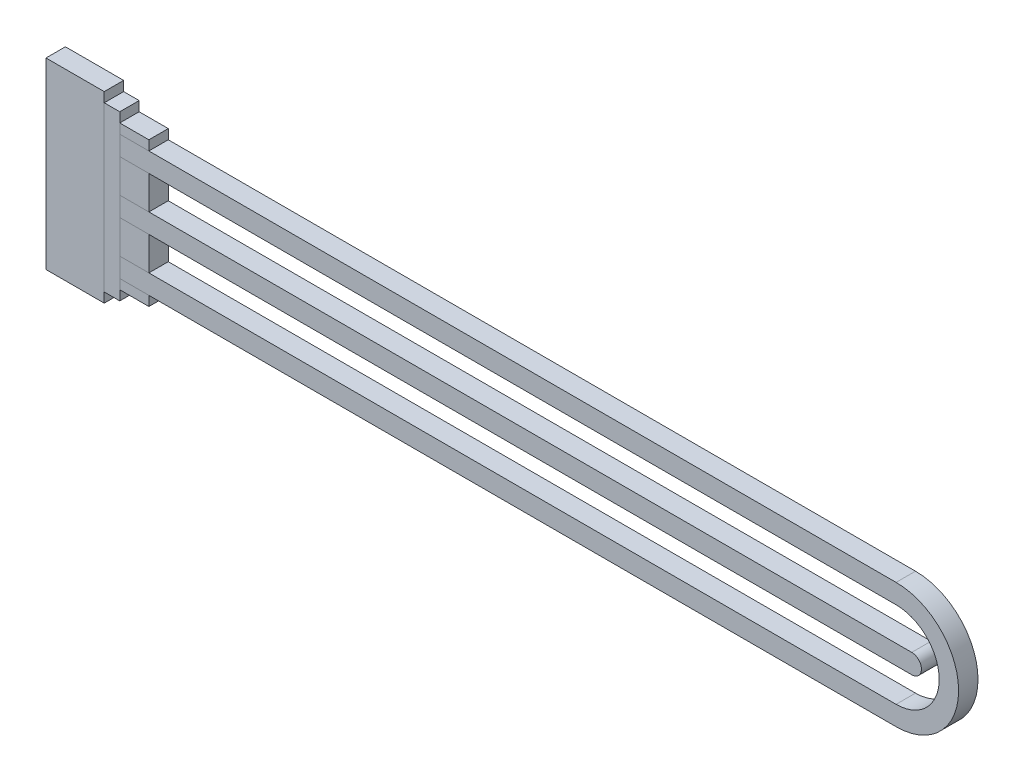
ISO-10303-21;
HEADER;
FILE_DESCRIPTION(('STEP AP214'),'2;1');
FILE_NAME('part.step','',(''),(''),'','','');
FILE_SCHEMA(('AUTOMOTIVE_DESIGN { 1 0 10303 214 1 1 1 1 }'));
ENDSEC;
DATA;
#1=APPLICATION_CONTEXT('core data for automotive mechanical design processes');
#2=APPLICATION_PROTOCOL_DEFINITION('international standard','automotive_design',2000,#1);
#3=PRODUCT_CONTEXT('',#1,'mechanical');
#4=PRODUCT('Part','Part','',(#3));
#5=PRODUCT_RELATED_PRODUCT_CATEGORY('part','',(#4));
#6=PRODUCT_DEFINITION_FORMATION('','',#4);
#7=PRODUCT_DEFINITION_CONTEXT('part definition',#1,'design');
#8=PRODUCT_DEFINITION('design','',#6,#7);
#9=PRODUCT_DEFINITION_SHAPE('','',#8);
#10=(LENGTH_UNIT() NAMED_UNIT(*) SI_UNIT(.MILLI.,.METRE.));
#11=(NAMED_UNIT(*) PLANE_ANGLE_UNIT() SI_UNIT($,.RADIAN.));
#12=(NAMED_UNIT(*) SI_UNIT($,.STERADIAN.) SOLID_ANGLE_UNIT());
#13=UNCERTAINTY_MEASURE_WITH_UNIT(LENGTH_MEASURE(1.E-05),#10,'distance_accuracy_value','');
#14=(GEOMETRIC_REPRESENTATION_CONTEXT(3) GLOBAL_UNCERTAINTY_ASSIGNED_CONTEXT((#13)) GLOBAL_UNIT_ASSIGNED_CONTEXT((#10,
#11,#12)) REPRESENTATION_CONTEXT('',''));
#15=CARTESIAN_POINT('',(0.,0.,0.));
#16=DIRECTION('',(0.,0.,1.));
#17=DIRECTION('',(1.,0.,0.));
#18=AXIS2_PLACEMENT_3D('',#15,#16,#17);
#19=CARTESIAN_POINT('',(-38.,15.,9.99999999999998));
#20=DIRECTION('',(0.,0.,-1.));
#21=DIRECTION('',(-1.,0.,0.));
#22=AXIS2_PLACEMENT_3D('',#19,#20,#21);
#23=PLANE('',#22);
#24=DIRECTION('',(0.,1.,0.));
#25=VECTOR('',#24,1.);
#26=CARTESIAN_POINT('',(-7.99999999999999,15.,9.99999999999998));
#27=LINE('',#26,#25);
#28=CARTESIAN_POINT('',(-7.99999999999999,-79.4096844460773,9.99999999999998));
#29=VERTEX_POINT('',#28);
#30=CARTESIAN_POINT('',(-7.99999999999999,15.,9.99999999999998));
#31=VERTEX_POINT('',#30);
#32=EDGE_CURVE('E112',#29,#31,#27,.T.);
#33=ORIENTED_EDGE('',*,*,#32,.T.);
#34=DIRECTION('',(1.,0.,0.));
#35=VECTOR('',#34,1.);
#36=CARTESIAN_POINT('',(-38.,15.,9.99999999999998));
#37=LINE('',#36,#35);
#38=CARTESIAN_POINT('',(-38.,15.,9.99999999999998));
#39=VERTEX_POINT('',#38);
#40=EDGE_CURVE('E12',#39,#31,#37,.T.);
#41=ORIENTED_EDGE('',*,*,#40,.F.);
#42=DIRECTION('',(0.,1.,0.));
#43=VECTOR('',#42,1.);
#44=CARTESIAN_POINT('',(-38.,15.,9.99999999999998));
#45=LINE('',#44,#43);
#46=CARTESIAN_POINT('',(-38.,-79.4096844460773,9.99999999999998));
#47=VERTEX_POINT('',#46);
#48=EDGE_CURVE('E100',#47,#39,#45,.T.);
#49=ORIENTED_EDGE('',*,*,#48,.F.);
#50=DIRECTION('',(1.,0.,0.));
#51=VECTOR('',#50,1.);
#52=CARTESIAN_POINT('',(-38.,-79.4096844460773,9.99999999999998));
#53=LINE('',#52,#51);
#54=EDGE_CURVE('E108',#47,#29,#53,.T.);
#55=ORIENTED_EDGE('',*,*,#54,.T.);
#56=EDGE_LOOP('',(#33,#41,#49,#55));
#57=FACE_BOUND('',#56,.T.);
#58=ADVANCED_FACE('F49',(#57),#23,.F.);
#59=CARTESIAN_POINT('',(-38.,15.,0.));
#60=DIRECTION('',(0.,-1.,0.));
#61=DIRECTION('',(0.,0.,-1.));
#62=AXIS2_PLACEMENT_3D('',#59,#60,#61);
#63=PLANE('',#62);
#64=DIRECTION('',(0.,0.,-1.));
#65=VECTOR('',#64,1.);
#66=CARTESIAN_POINT('',(-7.99999999999999,15.,0.));
#67=LINE('',#66,#65);
#68=CARTESIAN_POINT('',(-7.99999999999999,15.,0.));
#69=VERTEX_POINT('',#68);
#70=EDGE_CURVE('E104',#31,#69,#67,.T.);
#71=ORIENTED_EDGE('',*,*,#70,.T.);
#72=DIRECTION('',(1.,0.,0.));
#73=VECTOR('',#72,1.);
#74=CARTESIAN_POINT('',(-38.,15.,0.));
#75=LINE('',#74,#73);
#76=CARTESIAN_POINT('',(-38.,15.,0.));
#77=VERTEX_POINT('',#76);
#78=EDGE_CURVE('E57',#77,#69,#75,.T.);
#79=ORIENTED_EDGE('',*,*,#78,.F.);
#80=DIRECTION('',(0.,0.,-1.));
#81=VECTOR('',#80,1.);
#82=CARTESIAN_POINT('',(-38.,15.,0.));
#83=LINE('',#82,#81);
#84=EDGE_CURVE('E95',#39,#77,#83,.T.);
#85=ORIENTED_EDGE('',*,*,#84,.F.);
#86=ORIENTED_EDGE('',*,*,#40,.T.);
#87=EDGE_LOOP('',(#71,#79,#85,#86));
#88=FACE_BOUND('',#87,.T.);
#89=ADVANCED_FACE('F103',(#88),#63,.F.);
#90=CARTESIAN_POINT('',(-38.,15.,0.));
#91=DIRECTION('',(0.,0.,1.));
#92=DIRECTION('',(0.,-1.,0.));
#93=AXIS2_PLACEMENT_3D('',#90,#91,#92);
#94=PLANE('',#93);
#95=DIRECTION('',(0.,-1.,0.));
#96=VECTOR('',#95,1.);
#97=CARTESIAN_POINT('',(-7.99999999999999,15.,0.));
#98=LINE('',#97,#96);
#99=CARTESIAN_POINT('',(-7.99999999999999,-79.4096844460773,0.));
#100=VERTEX_POINT('',#99);
#101=EDGE_CURVE('E82',#69,#100,#98,.T.);
#102=ORIENTED_EDGE('',*,*,#101,.T.);
#103=DIRECTION('',(1.,0.,0.));
#104=VECTOR('',#103,1.);
#105=CARTESIAN_POINT('',(-38.,-79.4096844460773,0.));
#106=LINE('',#105,#104);
#107=CARTESIAN_POINT('',(-38.,-79.4096844460773,0.));
#108=VERTEX_POINT('',#107);
#109=EDGE_CURVE('E105',#108,#100,#106,.T.);
#110=ORIENTED_EDGE('',*,*,#109,.F.);
#111=DIRECTION('',(0.,-1.,0.));
#112=VECTOR('',#111,1.);
#113=CARTESIAN_POINT('',(-38.,15.,0.));
#114=LINE('',#113,#112);
#115=EDGE_CURVE('E98',#77,#108,#114,.T.);
#116=ORIENTED_EDGE('',*,*,#115,.F.);
#117=ORIENTED_EDGE('',*,*,#78,.T.);
#118=EDGE_LOOP('',(#102,#110,#116,#117));
#119=FACE_BOUND('',#118,.T.);
#120=ADVANCED_FACE('F106',(#119),#94,.F.);
#121=CARTESIAN_POINT('',(-38.,-79.4096844460773,0.));
#122=DIRECTION('',(0.,1.,0.));
#123=DIRECTION('',(0.,0.,1.));
#124=AXIS2_PLACEMENT_3D('',#121,#122,#123);
#125=PLANE('',#124);
#126=DIRECTION('',(0.,0.,1.));
#127=VECTOR('',#126,1.);
#128=CARTESIAN_POINT('',(-7.99999999999999,-79.4096844460773,0.));
#129=LINE('',#128,#127);
#130=EDGE_CURVE('E88',#100,#29,#129,.T.);
#131=ORIENTED_EDGE('',*,*,#130,.T.);
#132=ORIENTED_EDGE('',*,*,#54,.F.);
#133=DIRECTION('',(0.,0.,1.));
#134=VECTOR('',#133,1.);
#135=CARTESIAN_POINT('',(-38.,-79.4096844460773,0.));
#136=LINE('',#135,#134);
#137=EDGE_CURVE('E65',#108,#47,#136,.T.);
#138=ORIENTED_EDGE('',*,*,#137,.F.);
#139=ORIENTED_EDGE('',*,*,#109,.T.);
#140=EDGE_LOOP('',(#131,#132,#138,#139));
#141=FACE_BOUND('',#140,.T.);
#142=ADVANCED_FACE('F119',(#141),#125,.F.);
#143=CARTESIAN_POINT('',(-38.,0.,0.));
#144=DIRECTION('',(-1.,0.,0.));
#145=DIRECTION('',(0.,0.,1.));
#146=AXIS2_PLACEMENT_3D('',#143,#144,#145);
#147=PLANE('',#146);
#148=ORIENTED_EDGE('',*,*,#48,.T.);
#149=ORIENTED_EDGE('',*,*,#84,.T.);
#150=ORIENTED_EDGE('',*,*,#115,.T.);
#151=ORIENTED_EDGE('',*,*,#137,.T.);
#152=EDGE_LOOP('',(#148,#149,#150,#151));
#153=FACE_BOUND('',#152,.T.);
#154=ADVANCED_FACE('F96',(#153),#147,.T.);
#155=CARTESIAN_POINT('',(-7.99999999999999,0.,0.));
#156=DIRECTION('',(-1.,0.,0.));
#157=DIRECTION('',(0.,0.,1.));
#158=AXIS2_PLACEMENT_3D('',#155,#156,#157);
#159=PLANE('',#158);
#160=ORIENTED_EDGE('',*,*,#32,.F.);
#161=ORIENTED_EDGE('',*,*,#130,.F.);
#162=ORIENTED_EDGE('',*,*,#101,.F.);
#163=ORIENTED_EDGE('',*,*,#70,.F.);
#164=EDGE_LOOP('',(#160,#161,#162,#163));
#165=FACE_BOUND('',#164,.T.);
#166=ADVANCED_FACE('F122',(#165),#159,.F.);
#167=CLOSED_SHELL('',(#58,#89,#120,#142,#154,#166));
#168=MANIFOLD_SOLID_BREP('B2',#167);
#169=CARTESIAN_POINT('',(-7.99999999999999,10.,9.99999999999998));
#170=DIRECTION('',(0.,0.,-1.));
#171=DIRECTION('',(-1.,0.,0.));
#172=AXIS2_PLACEMENT_3D('',#169,#170,#171);
#173=PLANE('',#172);
#174=DIRECTION('',(0.,1.,0.));
#175=VECTOR('',#174,1.);
#176=CARTESIAN_POINT('',(0.,10.,9.99999999999998));
#177=LINE('',#176,#175);
#178=CARTESIAN_POINT('',(0.,-74.4096844460773,9.99999999999998));
#179=VERTEX_POINT('',#178);
#180=CARTESIAN_POINT('',(0.,10.,9.99999999999998));
#181=VERTEX_POINT('',#180);
#182=EDGE_CURVE('E257',#179,#181,#177,.T.);
#183=ORIENTED_EDGE('',*,*,#182,.T.);
#184=DIRECTION('',(1.,0.,0.));
#185=VECTOR('',#184,1.);
#186=CARTESIAN_POINT('',(-7.99999999999999,10.,9.99999999999998));
#187=LINE('',#186,#185);
#188=CARTESIAN_POINT('',(-7.99999999999999,10.,9.99999999999998));
#189=VERTEX_POINT('',#188);
#190=EDGE_CURVE('E47',#189,#181,#187,.T.);
#191=ORIENTED_EDGE('',*,*,#190,.F.);
#192=DIRECTION('',(0.,1.,0.));
#193=VECTOR('',#192,1.);
#194=CARTESIAN_POINT('',(-7.99999999999999,10.,9.99999999999998));
#195=LINE('',#194,#193);
#196=CARTESIAN_POINT('',(-7.99999999999999,-74.4096844460773,9.99999999999998));
#197=VERTEX_POINT('',#196);
#198=EDGE_CURVE('E245',#197,#189,#195,.T.);
#199=ORIENTED_EDGE('',*,*,#198,.F.);
#200=DIRECTION('',(1.,0.,0.));
#201=VECTOR('',#200,1.);
#202=CARTESIAN_POINT('',(-7.99999999999999,-74.4096844460773,9.99999999999998));
#203=LINE('',#202,#201);
#204=EDGE_CURVE('E253',#197,#179,#203,.T.);
#205=ORIENTED_EDGE('',*,*,#204,.T.);
#206=EDGE_LOOP('',(#183,#191,#199,#205));
#207=FACE_BOUND('',#206,.T.);
#208=ADVANCED_FACE('F194',(#207),#173,.F.);
#209=CARTESIAN_POINT('',(-7.99999999999999,10.,0.));
#210=DIRECTION('',(0.,-1.,0.));
#211=DIRECTION('',(0.,0.,-1.));
#212=AXIS2_PLACEMENT_3D('',#209,#210,#211);
#213=PLANE('',#212);
#214=DIRECTION('',(0.,0.,-1.));
#215=VECTOR('',#214,1.);
#216=CARTESIAN_POINT('',(0.,10.,0.));
#217=LINE('',#216,#215);
#218=CARTESIAN_POINT('',(0.,10.,0.));
#219=VERTEX_POINT('',#218);
#220=EDGE_CURVE('E249',#181,#219,#217,.T.);
#221=ORIENTED_EDGE('',*,*,#220,.T.);
#222=DIRECTION('',(1.,0.,0.));
#223=VECTOR('',#222,1.);
#224=CARTESIAN_POINT('',(-7.99999999999999,10.,0.));
#225=LINE('',#224,#223);
#226=CARTESIAN_POINT('',(-7.99999999999999,10.,0.));
#227=VERTEX_POINT('',#226);
#228=EDGE_CURVE('E202',#227,#219,#225,.T.);
#229=ORIENTED_EDGE('',*,*,#228,.F.);
#230=DIRECTION('',(0.,0.,-1.));
#231=VECTOR('',#230,1.);
#232=CARTESIAN_POINT('',(-7.99999999999999,10.,0.));
#233=LINE('',#232,#231);
#234=EDGE_CURVE('E240',#189,#227,#233,.T.);
#235=ORIENTED_EDGE('',*,*,#234,.F.);
#236=ORIENTED_EDGE('',*,*,#190,.T.);
#237=EDGE_LOOP('',(#221,#229,#235,#236));
#238=FACE_BOUND('',#237,.T.);
#239=ADVANCED_FACE('F248',(#238),#213,.F.);
#240=CARTESIAN_POINT('',(-7.99999999999999,10.,0.));
#241=DIRECTION('',(0.,0.,1.));
#242=DIRECTION('',(1.,0.,0.));
#243=AXIS2_PLACEMENT_3D('',#240,#241,#242);
#244=PLANE('',#243);
#245=DIRECTION('',(0.,-1.,0.));
#246=VECTOR('',#245,1.);
#247=CARTESIAN_POINT('',(0.,10.,0.));
#248=LINE('',#247,#246);
#249=CARTESIAN_POINT('',(0.,-74.4096844460773,0.));
#250=VERTEX_POINT('',#249);
#251=EDGE_CURVE('E227',#219,#250,#248,.T.);
#252=ORIENTED_EDGE('',*,*,#251,.T.);
#253=DIRECTION('',(1.,0.,0.));
#254=VECTOR('',#253,1.);
#255=CARTESIAN_POINT('',(-7.99999999999999,-74.4096844460773,0.));
#256=LINE('',#255,#254);
#257=CARTESIAN_POINT('',(-7.99999999999999,-74.4096844460773,0.));
#258=VERTEX_POINT('',#257);
#259=EDGE_CURVE('E250',#258,#250,#256,.T.);
#260=ORIENTED_EDGE('',*,*,#259,.F.);
#261=DIRECTION('',(0.,-1.,0.));
#262=VECTOR('',#261,1.);
#263=CARTESIAN_POINT('',(-7.99999999999999,10.,0.));
#264=LINE('',#263,#262);
#265=EDGE_CURVE('E243',#227,#258,#264,.T.);
#266=ORIENTED_EDGE('',*,*,#265,.F.);
#267=ORIENTED_EDGE('',*,*,#228,.T.);
#268=EDGE_LOOP('',(#252,#260,#266,#267));
#269=FACE_BOUND('',#268,.T.);
#270=ADVANCED_FACE('F251',(#269),#244,.F.);
#271=CARTESIAN_POINT('',(-7.99999999999999,-74.4096844460773,0.));
#272=DIRECTION('',(0.,1.,0.));
#273=DIRECTION('',(0.,0.,1.));
#274=AXIS2_PLACEMENT_3D('',#271,#272,#273);
#275=PLANE('',#274);
#276=DIRECTION('',(0.,0.,1.));
#277=VECTOR('',#276,1.);
#278=CARTESIAN_POINT('',(0.,-74.4096844460773,0.));
#279=LINE('',#278,#277);
#280=EDGE_CURVE('E233',#250,#179,#279,.T.);
#281=ORIENTED_EDGE('',*,*,#280,.T.);
#282=ORIENTED_EDGE('',*,*,#204,.F.);
#283=DIRECTION('',(0.,0.,1.));
#284=VECTOR('',#283,1.);
#285=CARTESIAN_POINT('',(-7.99999999999999,-74.4096844460773,0.));
#286=LINE('',#285,#284);
#287=EDGE_CURVE('E210',#258,#197,#286,.T.);
#288=ORIENTED_EDGE('',*,*,#287,.F.);
#289=ORIENTED_EDGE('',*,*,#259,.T.);
#290=EDGE_LOOP('',(#281,#282,#288,#289));
#291=FACE_BOUND('',#290,.T.);
#292=ADVANCED_FACE('F264',(#291),#275,.F.);
#293=CARTESIAN_POINT('',(-7.99999999999999,0.,0.));
#294=DIRECTION('',(-1.,0.,0.));
#295=DIRECTION('',(0.,0.,1.));
#296=AXIS2_PLACEMENT_3D('',#293,#294,#295);
#297=PLANE('',#296);
#298=ORIENTED_EDGE('',*,*,#198,.T.);
#299=ORIENTED_EDGE('',*,*,#234,.T.);
#300=ORIENTED_EDGE('',*,*,#265,.T.);
#301=ORIENTED_EDGE('',*,*,#287,.T.);
#302=EDGE_LOOP('',(#298,#299,#300,#301));
#303=FACE_BOUND('',#302,.T.);
#304=ADVANCED_FACE('F241',(#303),#297,.T.);
#305=CARTESIAN_POINT('',(0.,0.,0.));
#306=DIRECTION('',(-1.,0.,0.));
#307=DIRECTION('',(0.,0.,1.));
#308=AXIS2_PLACEMENT_3D('',#305,#306,#307);
#309=PLANE('',#308);
#310=ORIENTED_EDGE('',*,*,#182,.F.);
#311=ORIENTED_EDGE('',*,*,#280,.F.);
#312=ORIENTED_EDGE('',*,*,#251,.F.);
#313=ORIENTED_EDGE('',*,*,#220,.F.);
#314=EDGE_LOOP('',(#310,#311,#312,#313));
#315=FACE_BOUND('',#314,.T.);
#316=ADVANCED_FACE('F267',(#315),#309,.F.);
#317=CLOSED_SHELL('',(#208,#239,#270,#292,#304,#316));
#318=MANIFOLD_SOLID_BREP('B6',#317);
#319=CARTESIAN_POINT('',(15.,5.,10.));
#320=DIRECTION('',(0.,0.,-1.));
#321=DIRECTION('',(0.,1.,0.));
#322=AXIS2_PLACEMENT_3D('',#319,#320,#321);
#323=PLANE('',#322);
#324=DIRECTION('',(0.,-1.,0.));
#325=VECTOR('',#324,1.);
#326=CARTESIAN_POINT('',(0.,5.,10.));
#327=LINE('',#326,#325);
#328=CARTESIAN_POINT('',(0.,5.,10.));
#329=VERTEX_POINT('',#328);
#330=CARTESIAN_POINT('',(0.,-69.4096844460773,10.));
#331=VERTEX_POINT('',#330);
#332=EDGE_CURVE('E400',#329,#331,#327,.T.);
#333=ORIENTED_EDGE('',*,*,#332,.T.);
#334=DIRECTION('',(-1.,0.,0.));
#335=VECTOR('',#334,1.);
#336=CARTESIAN_POINT('',(15.,-69.4096844460773,10.));
#337=LINE('',#336,#335);
#338=CARTESIAN_POINT('',(15.,-69.4096844460773,10.));
#339=VERTEX_POINT('',#338);
#340=EDGE_CURVE('E192',#339,#331,#337,.T.);
#341=ORIENTED_EDGE('',*,*,#340,.F.);
#342=DIRECTION('',(0.,-1.,0.));
#343=VECTOR('',#342,1.);
#344=CARTESIAN_POINT('',(15.,5.,10.));
#345=LINE('',#344,#343);
#346=CARTESIAN_POINT('',(15.,5.,10.));
#347=VERTEX_POINT('',#346);
#348=EDGE_CURVE('E388',#347,#339,#345,.T.);
#349=ORIENTED_EDGE('',*,*,#348,.F.);
#350=DIRECTION('',(-1.,0.,0.));
#351=VECTOR('',#350,1.);
#352=CARTESIAN_POINT('',(15.,5.,10.));
#353=LINE('',#352,#351);
#354=EDGE_CURVE('E396',#347,#329,#353,.T.);
#355=ORIENTED_EDGE('',*,*,#354,.T.);
#356=EDGE_LOOP('',(#333,#341,#349,#355));
#357=FACE_BOUND('',#356,.T.);
#358=ADVANCED_FACE('F337',(#357),#323,.F.);
#359=CARTESIAN_POINT('',(15.,-69.4096844460773,0.));
#360=DIRECTION('',(0.,1.,0.));
#361=DIRECTION('',(0.,0.,1.));
#362=AXIS2_PLACEMENT_3D('',#359,#360,#361);
#363=PLANE('',#362);
#364=DIRECTION('',(0.,0.,-1.));
#365=VECTOR('',#364,1.);
#366=CARTESIAN_POINT('',(0.,-69.4096844460773,0.));
#367=LINE('',#366,#365);
#368=CARTESIAN_POINT('',(0.,-69.4096844460773,0.));
#369=VERTEX_POINT('',#368);
#370=EDGE_CURVE('E392',#331,#369,#367,.T.);
#371=ORIENTED_EDGE('',*,*,#370,.T.);
#372=DIRECTION('',(-1.,0.,0.));
#373=VECTOR('',#372,1.);
#374=CARTESIAN_POINT('',(15.,-69.4096844460773,0.));
#375=LINE('',#374,#373);
#376=CARTESIAN_POINT('',(15.,-69.4096844460773,0.));
#377=VERTEX_POINT('',#376);
#378=EDGE_CURVE('E345',#377,#369,#375,.T.);
#379=ORIENTED_EDGE('',*,*,#378,.F.);
#380=DIRECTION('',(0.,0.,-1.));
#381=VECTOR('',#380,1.);
#382=CARTESIAN_POINT('',(15.,-69.4096844460773,0.));
#383=LINE('',#382,#381);
#384=EDGE_CURVE('E383',#339,#377,#383,.T.);
#385=ORIENTED_EDGE('',*,*,#384,.F.);
#386=ORIENTED_EDGE('',*,*,#340,.T.);
#387=EDGE_LOOP('',(#371,#379,#385,#386));
#388=FACE_BOUND('',#387,.T.);
#389=ADVANCED_FACE('F391',(#388),#363,.F.);
#390=CARTESIAN_POINT('',(15.,5.,0.));
#391=DIRECTION('',(0.,0.,1.));
#392=DIRECTION('',(0.,-1.,0.));
#393=AXIS2_PLACEMENT_3D('',#390,#391,#392);
#394=PLANE('',#393);
#395=DIRECTION('',(0.,1.,0.));
#396=VECTOR('',#395,1.);
#397=CARTESIAN_POINT('',(0.,5.,0.));
#398=LINE('',#397,#396);
#399=CARTESIAN_POINT('',(0.,5.,0.));
#400=VERTEX_POINT('',#399);
#401=EDGE_CURVE('E370',#369,#400,#398,.T.);
#402=ORIENTED_EDGE('',*,*,#401,.T.);
#403=DIRECTION('',(-1.,0.,0.));
#404=VECTOR('',#403,1.);
#405=CARTESIAN_POINT('',(15.,5.,0.));
#406=LINE('',#405,#404);
#407=CARTESIAN_POINT('',(15.,5.,0.));
#408=VERTEX_POINT('',#407);
#409=EDGE_CURVE('E393',#408,#400,#406,.T.);
#410=ORIENTED_EDGE('',*,*,#409,.F.);
#411=DIRECTION('',(0.,1.,0.));
#412=VECTOR('',#411,1.);
#413=CARTESIAN_POINT('',(15.,5.,0.));
#414=LINE('',#413,#412);
#415=EDGE_CURVE('E386',#377,#408,#414,.T.);
#416=ORIENTED_EDGE('',*,*,#415,.F.);
#417=ORIENTED_EDGE('',*,*,#378,.T.);
#418=EDGE_LOOP('',(#402,#410,#416,#417));
#419=FACE_BOUND('',#418,.T.);
#420=ADVANCED_FACE('F394',(#419),#394,.F.);
#421=CARTESIAN_POINT('',(15.,5.,0.));
#422=DIRECTION('',(0.,-1.,0.));
#423=DIRECTION('',(0.,0.,-1.));
#424=AXIS2_PLACEMENT_3D('',#421,#422,#423);
#425=PLANE('',#424);
#426=DIRECTION('',(0.,0.,1.));
#427=VECTOR('',#426,1.);
#428=CARTESIAN_POINT('',(0.,5.,0.));
#429=LINE('',#428,#427);
#430=EDGE_CURVE('E376',#400,#329,#429,.T.);
#431=ORIENTED_EDGE('',*,*,#430,.T.);
#432=ORIENTED_EDGE('',*,*,#354,.F.);
#433=DIRECTION('',(0.,0.,1.));
#434=VECTOR('',#433,1.);
#435=CARTESIAN_POINT('',(15.,5.,0.));
#436=LINE('',#435,#434);
#437=EDGE_CURVE('E353',#408,#347,#436,.T.);
#438=ORIENTED_EDGE('',*,*,#437,.F.);
#439=ORIENTED_EDGE('',*,*,#409,.T.);
#440=EDGE_LOOP('',(#431,#432,#438,#439));
#441=FACE_BOUND('',#440,.T.);
#442=ADVANCED_FACE('F407',(#441),#425,.F.);
#443=CARTESIAN_POINT('',(15.,0.,0.));
#444=DIRECTION('',(-1.,0.,0.));
#445=DIRECTION('',(0.,0.,1.));
#446=AXIS2_PLACEMENT_3D('',#443,#444,#445);
#447=PLANE('',#446);
#448=ORIENTED_EDGE('',*,*,#348,.T.);
#449=ORIENTED_EDGE('',*,*,#384,.T.);
#450=ORIENTED_EDGE('',*,*,#415,.T.);
#451=ORIENTED_EDGE('',*,*,#437,.T.);
#452=EDGE_LOOP('',(#448,#449,#450,#451));
#453=FACE_BOUND('',#452,.T.);
#454=ADVANCED_FACE('F384',(#453),#447,.F.);
#455=CARTESIAN_POINT('',(0.,0.,0.));
#456=DIRECTION('',(-1.,0.,0.));
#457=DIRECTION('',(0.,0.,1.));
#458=AXIS2_PLACEMENT_3D('',#455,#456,#457);
#459=PLANE('',#458);
#460=ORIENTED_EDGE('',*,*,#332,.F.);
#461=ORIENTED_EDGE('',*,*,#430,.F.);
#462=ORIENTED_EDGE('',*,*,#401,.F.);
#463=ORIENTED_EDGE('',*,*,#370,.F.);
#464=EDGE_LOOP('',(#460,#461,#462,#463));
#465=FACE_BOUND('',#464,.T.);
#466=ADVANCED_FACE('F410',(#465),#459,.T.);
#467=CLOSED_SHELL('',(#358,#389,#420,#442,#454,#466));
#468=MANIFOLD_SOLID_BREP('B41',#467);
#469=CARTESIAN_POINT('',(-15.,-59.4096844460773,5.));
#470=DIRECTION('',(1.,0.,0.));
#471=DIRECTION('',(0.,0.,-1.));
#472=AXIS2_PLACEMENT_3D('',#469,#470,#471);
#473=CYLINDRICAL_SURFACE('',#472,3.);
#474=CARTESIAN_POINT('',(-15.,-59.4096844460773,5.));
#475=DIRECTION('',(-1.,0.,0.));
#476=DIRECTION('',(0.,0.,1.));
#477=AXIS2_PLACEMENT_3D('',#474,#475,#476);
#478=CIRCLE('',#477,3.);
#479=CARTESIAN_POINT('',(-15.,-59.4096844460773,8.));
#480=VERTEX_POINT('',#479);
#481=EDGE_CURVE('E336',#480,#480,#478,.T.);
#482=ORIENTED_EDGE('',*,*,#481,.F.);
#483=EDGE_LOOP('',(#482));
#484=FACE_BOUND('',#483,.T.);
#485=CARTESIAN_POINT('',(0.,-59.4096844460773,5.));
#486=DIRECTION('',(-1.,0.,0.));
#487=DIRECTION('',(0.,0.,1.));
#488=AXIS2_PLACEMENT_3D('',#485,#486,#487);
#489=CIRCLE('',#488,3.);
#490=CARTESIAN_POINT('',(0.,-59.4096844460773,8.));
#491=VERTEX_POINT('',#490);
#492=EDGE_CURVE('E483',#491,#491,#489,.T.);
#493=ORIENTED_EDGE('',*,*,#492,.T.);
#494=EDGE_LOOP('',(#493));
#495=FACE_BOUND('',#494,.T.);
#496=ADVANCED_FACE('F480',(#484,#495),#473,.T.);
#497=CARTESIAN_POINT('',(-15.,-59.4096844460773,5.));
#498=DIRECTION('',(-1.,0.,0.));
#499=DIRECTION('',(0.,0.,1.));
#500=AXIS2_PLACEMENT_3D('',#497,#498,#499);
#501=PLANE('',#500);
#502=ORIENTED_EDGE('',*,*,#481,.T.);
#503=EDGE_LOOP('',(#502));
#504=FACE_BOUND('',#503,.T.);
#505=ADVANCED_FACE('F495',(#504),#501,.T.);
#506=CARTESIAN_POINT('',(0.,-59.4096844460773,5.));
#507=DIRECTION('',(-1.,0.,0.));
#508=DIRECTION('',(0.,0.,1.));
#509=AXIS2_PLACEMENT_3D('',#506,#507,#508);
#510=PLANE('',#509);
#511=ORIENTED_EDGE('',*,*,#492,.F.);
#512=EDGE_LOOP('',(#511));
#513=FACE_BOUND('',#512,.T.);
#514=ADVANCED_FACE('F493',(#513),#510,.F.);
#515=CLOSED_SHELL('',(#496,#505,#514));
#516=MANIFOLD_SOLID_BREP('B186',#515);
#517=CARTESIAN_POINT('',(-15.,-4.90697990871341,5.));
#518=DIRECTION('',(1.,0.,0.));
#519=DIRECTION('',(0.,0.,-1.));
#520=AXIS2_PLACEMENT_3D('',#517,#518,#519);
#521=CYLINDRICAL_SURFACE('',#520,3.);
#522=CARTESIAN_POINT('',(-15.,-4.90697990871341,5.));
#523=DIRECTION('',(-1.,0.,0.));
#524=DIRECTION('',(0.,0.,1.));
#525=AXIS2_PLACEMENT_3D('',#522,#523,#524);
#526=CIRCLE('',#525,3.);
#527=CARTESIAN_POINT('',(-15.,-4.90697990871341,8.));
#528=VERTEX_POINT('',#527);
#529=EDGE_CURVE('E479',#528,#528,#526,.T.);
#530=ORIENTED_EDGE('',*,*,#529,.F.);
#531=EDGE_LOOP('',(#530));
#532=FACE_BOUND('',#531,.T.);
#533=CARTESIAN_POINT('',(0.,-4.90697990871341,5.));
#534=DIRECTION('',(-1.,0.,0.));
#535=DIRECTION('',(0.,0.,1.));
#536=AXIS2_PLACEMENT_3D('',#533,#534,#535);
#537=CIRCLE('',#536,3.);
#538=CARTESIAN_POINT('',(0.,-4.90697990871341,8.));
#539=VERTEX_POINT('',#538);
#540=EDGE_CURVE('E539',#539,#539,#537,.T.);
#541=ORIENTED_EDGE('',*,*,#540,.T.);
#542=EDGE_LOOP('',(#541));
#543=FACE_BOUND('',#542,.T.);
#544=ADVANCED_FACE('F536',(#532,#543),#521,.T.);
#545=CARTESIAN_POINT('',(-15.,-4.90697990871341,5.));
#546=DIRECTION('',(-1.,0.,0.));
#547=DIRECTION('',(0.,0.,1.));
#548=AXIS2_PLACEMENT_3D('',#545,#546,#547);
#549=PLANE('',#548);
#550=ORIENTED_EDGE('',*,*,#529,.T.);
#551=EDGE_LOOP('',(#550));
#552=FACE_BOUND('',#551,.T.);
#553=ADVANCED_FACE('F551',(#552),#549,.T.);
#554=CARTESIAN_POINT('',(0.,-4.90697990871341,5.));
#555=DIRECTION('',(-1.,0.,0.));
#556=DIRECTION('',(0.,0.,1.));
#557=AXIS2_PLACEMENT_3D('',#554,#555,#556);
#558=PLANE('',#557);
#559=ORIENTED_EDGE('',*,*,#540,.F.);
#560=EDGE_LOOP('',(#559));
#561=FACE_BOUND('',#560,.T.);
#562=ADVANCED_FACE('F549',(#561),#558,.F.);
#563=CLOSED_SHELL('',(#544,#553,#562));
#564=MANIFOLD_SOLID_BREP('B331',#563);
#565=CARTESIAN_POINT('',(0.,-27.2048422230386,10.));
#566=DIRECTION('',(1.,0.,0.));
#567=DIRECTION('',(0.,1.,0.));
#568=AXIS2_PLACEMENT_3D('',#565,#566,#567);
#569=PLANE('',#568);
#570=DIRECTION('',(0.,-1.,0.));
#571=VECTOR('',#570,1.);
#572=CARTESIAN_POINT('',(0.,-27.2048422230386,0.));
#573=LINE('',#572,#571);
#574=CARTESIAN_POINT('',(0.,-27.2048422230386,0.));
#575=VERTEX_POINT('',#574);
#576=CARTESIAN_POINT('',(0.,-37.2048422230386,0.));
#577=VERTEX_POINT('',#576);
#578=EDGE_CURVE('E534',#575,#577,#573,.T.);
#579=ORIENTED_EDGE('',*,*,#578,.T.);
#580=DIRECTION('',(0.,0.,-1.));
#581=VECTOR('',#580,1.);
#582=CARTESIAN_POINT('',(0.,-37.2048422230386,10.));
#583=LINE('',#582,#581);
#584=CARTESIAN_POINT('',(0.,-37.2048422230386,10.));
#585=VERTEX_POINT('',#584);
#586=EDGE_CURVE('E662',#585,#577,#583,.T.);
#587=ORIENTED_EDGE('',*,*,#586,.F.);
#588=DIRECTION('',(0.,-1.,0.));
#589=VECTOR('',#588,1.);
#590=CARTESIAN_POINT('',(0.,-27.2048422230386,10.));
#591=LINE('',#590,#589);
#592=CARTESIAN_POINT('',(0.,-27.2048422230386,10.));
#593=VERTEX_POINT('',#592);
#594=EDGE_CURVE('E595',#593,#585,#591,.T.);
#595=ORIENTED_EDGE('',*,*,#594,.F.);
#596=DIRECTION('',(0.,0.,-1.));
#597=VECTOR('',#596,1.);
#598=CARTESIAN_POINT('',(0.,-27.2048422230386,10.));
#599=LINE('',#598,#597);
#600=EDGE_CURVE('E650',#593,#575,#599,.T.);
#601=ORIENTED_EDGE('',*,*,#600,.T.);
#602=EDGE_LOOP('',(#579,#587,#595,#601));
#603=FACE_BOUND('',#602,.T.);
#604=ADVANCED_FACE('F591',(#603),#569,.F.);
#605=CARTESIAN_POINT('',(0.,-37.2048422230386,10.));
#606=DIRECTION('',(0.,1.,0.));
#607=DIRECTION('',(-1.,0.,0.));
#608=AXIS2_PLACEMENT_3D('',#605,#606,#607);
#609=PLANE('',#608);
#610=DIRECTION('',(1.,0.,0.));
#611=VECTOR('',#610,1.);
#612=CARTESIAN_POINT('',(0.,-37.2048422230386,0.));
#613=LINE('',#612,#611);
#614=CARTESIAN_POINT('',(408.064158914082,-37.2048422230385,0.));
#615=VERTEX_POINT('',#614);
#616=EDGE_CURVE('E601',#577,#615,#613,.T.);
#617=ORIENTED_EDGE('',*,*,#616,.T.);
#618=DIRECTION('',(0.,0.,-1.));
#619=VECTOR('',#618,1.);
#620=CARTESIAN_POINT('',(408.064158914082,-37.2048422230385,10.));
#621=LINE('',#620,#619);
#622=CARTESIAN_POINT('',(408.064158914082,-37.2048422230385,10.));
#623=VERTEX_POINT('',#622);
#624=EDGE_CURVE('E646',#623,#615,#621,.T.);
#625=ORIENTED_EDGE('',*,*,#624,.F.);
#626=DIRECTION('',(1.,0.,0.));
#627=VECTOR('',#626,1.);
#628=CARTESIAN_POINT('',(0.,-37.2048422230386,10.));
#629=LINE('',#628,#627);
#630=EDGE_CURVE('E625',#585,#623,#629,.T.);
#631=ORIENTED_EDGE('',*,*,#630,.F.);
#632=ORIENTED_EDGE('',*,*,#586,.T.);
#633=EDGE_LOOP('',(#617,#625,#631,#632));
#634=FACE_BOUND('',#633,.T.);
#635=ADVANCED_FACE('F665',(#634),#609,.F.);
#636=CARTESIAN_POINT('',(408.064158914082,-32.2048422230385,10.));
#637=DIRECTION('',(0.,0.,-1.));
#638=DIRECTION('',(-1.,0.,0.));
#639=AXIS2_PLACEMENT_3D('',#636,#637,#638);
#640=CYLINDRICAL_SURFACE('',#639,5.);
#641=CARTESIAN_POINT('',(408.064158914082,-32.2048422230385,0.));
#642=DIRECTION('',(0.,0.,1.));
#643=DIRECTION('',(-1.,0.,0.));
#644=AXIS2_PLACEMENT_3D('',#641,#642,#643);
#645=CIRCLE('',#644,5.);
#646=CARTESIAN_POINT('',(408.064158914082,-27.2048422230385,0.));
#647=VERTEX_POINT('',#646);
#648=EDGE_CURVE('E641',#615,#647,#645,.T.);
#649=ORIENTED_EDGE('',*,*,#648,.T.);
#650=DIRECTION('',(0.,0.,-1.));
#651=VECTOR('',#650,1.);
#652=CARTESIAN_POINT('',(408.064158914082,-27.2048422230385,10.));
#653=LINE('',#652,#651);
#654=CARTESIAN_POINT('',(408.064158914082,-27.2048422230385,10.));
#655=VERTEX_POINT('',#654);
#656=EDGE_CURVE('E644',#655,#647,#653,.T.);
#657=ORIENTED_EDGE('',*,*,#656,.F.);
#658=CARTESIAN_POINT('',(408.064158914082,-32.2048422230385,10.));
#659=DIRECTION('',(0.,0.,1.));
#660=DIRECTION('',(-1.,0.,0.));
#661=AXIS2_PLACEMENT_3D('',#658,#659,#660);
#662=CIRCLE('',#661,5.);
#663=EDGE_CURVE('E658',#623,#655,#662,.T.);
#664=ORIENTED_EDGE('',*,*,#663,.F.);
#665=ORIENTED_EDGE('',*,*,#624,.T.);
#666=EDGE_LOOP('',(#649,#657,#664,#665));
#667=FACE_BOUND('',#666,.T.);
#668=ADVANCED_FACE('F642',(#667),#640,.T.);
#669=CARTESIAN_POINT('',(0.,-27.2048422230386,10.));
#670=DIRECTION('',(0.,-1.,0.));
#671=DIRECTION('',(1.,0.,0.));
#672=AXIS2_PLACEMENT_3D('',#669,#670,#671);
#673=PLANE('',#672);
#674=DIRECTION('',(-1.,0.,0.));
#675=VECTOR('',#674,1.);
#676=CARTESIAN_POINT('',(0.,-27.2048422230386,0.));
#677=LINE('',#676,#675);
#678=EDGE_CURVE('E635',#647,#575,#677,.T.);
#679=ORIENTED_EDGE('',*,*,#678,.T.);
#680=ORIENTED_EDGE('',*,*,#600,.F.);
#681=DIRECTION('',(-1.,0.,0.));
#682=VECTOR('',#681,1.);
#683=CARTESIAN_POINT('',(0.,-27.2048422230386,10.));
#684=LINE('',#683,#682);
#685=EDGE_CURVE('E649',#655,#593,#684,.T.);
#686=ORIENTED_EDGE('',*,*,#685,.F.);
#687=ORIENTED_EDGE('',*,*,#656,.T.);
#688=EDGE_LOOP('',(#679,#680,#686,#687));
#689=FACE_BOUND('',#688,.T.);
#690=ADVANCED_FACE('F648',(#689),#673,.F.);
#691=CARTESIAN_POINT('',(408.064158914082,-32.2048422230385,10.));
#692=DIRECTION('',(0.,0.,-1.));
#693=DIRECTION('',(-1.,0.,0.));
#694=AXIS2_PLACEMENT_3D('',#691,#692,#693);
#695=PLANE('',#694);
#696=ORIENTED_EDGE('',*,*,#594,.T.);
#697=ORIENTED_EDGE('',*,*,#630,.T.);
#698=ORIENTED_EDGE('',*,*,#663,.T.);
#699=ORIENTED_EDGE('',*,*,#685,.T.);
#700=EDGE_LOOP('',(#696,#697,#698,#699));
#701=FACE_BOUND('',#700,.T.);
#702=ADVANCED_FACE('F593',(#701),#695,.F.);
#703=CARTESIAN_POINT('',(408.064158914082,-32.2048422230385,0.));
#704=DIRECTION('',(0.,0.,-1.));
#705=DIRECTION('',(-1.,0.,0.));
#706=AXIS2_PLACEMENT_3D('',#703,#704,#705);
#707=PLANE('',#706);
#708=ORIENTED_EDGE('',*,*,#578,.F.);
#709=ORIENTED_EDGE('',*,*,#678,.F.);
#710=ORIENTED_EDGE('',*,*,#648,.F.);
#711=ORIENTED_EDGE('',*,*,#616,.F.);
#712=EDGE_LOOP('',(#708,#709,#710,#711));
#713=FACE_BOUND('',#712,.T.);
#714=ADVANCED_FACE('F652',(#713),#707,.T.);
#715=CLOSED_SHELL('',(#604,#635,#668,#690,#702,#714));
#716=MANIFOLD_SOLID_BREP('B474',#715);
#717=CARTESIAN_POINT('',(0.,-10.,10.));
#718=DIRECTION('',(1.,0.,0.));
#719=DIRECTION('',(0.,0.,-1.));
#720=AXIS2_PLACEMENT_3D('',#717,#718,#719);
#721=PLANE('',#720);
#722=DIRECTION('',(0.,-1.,0.));
#723=VECTOR('',#722,1.);
#724=CARTESIAN_POINT('',(0.,-10.,0.));
#725=LINE('',#724,#723);
#726=CARTESIAN_POINT('',(0.,0.,0.));
#727=VERTEX_POINT('',#726);
#728=CARTESIAN_POINT('',(0.,-10.,0.));
#729=VERTEX_POINT('',#728);
#730=EDGE_CURVE('E822',#727,#729,#725,.T.);
#731=ORIENTED_EDGE('',*,*,#730,.T.);
#732=DIRECTION('',(0.,0.,-1.));
#733=VECTOR('',#732,1.);
#734=CARTESIAN_POINT('',(0.,-10.,10.));
#735=LINE('',#734,#733);
#736=CARTESIAN_POINT('',(0.,-10.,10.));
#737=VERTEX_POINT('',#736);
#738=EDGE_CURVE('E589',#737,#729,#735,.T.);
#739=ORIENTED_EDGE('',*,*,#738,.F.);
#740=DIRECTION('',(0.,-1.,0.));
#741=VECTOR('',#740,1.);
#742=CARTESIAN_POINT('',(0.,-10.,10.));
#743=LINE('',#742,#741);
#744=CARTESIAN_POINT('',(0.,0.,10.));
#745=VERTEX_POINT('',#744);
#746=EDGE_CURVE('E836',#745,#737,#743,.T.);
#747=ORIENTED_EDGE('',*,*,#746,.F.);
#748=DIRECTION('',(0.,0.,-1.));
#749=VECTOR('',#748,1.);
#750=CARTESIAN_POINT('',(0.,0.,10.));
#751=LINE('',#750,#749);
#752=EDGE_CURVE('E818',#745,#727,#751,.T.);
#753=ORIENTED_EDGE('',*,*,#752,.T.);
#754=EDGE_LOOP('',(#731,#739,#747,#753));
#755=FACE_BOUND('',#754,.T.);
#756=ADVANCED_FACE('F726',(#755),#721,.F.);
#757=CARTESIAN_POINT('',(0.,-10.,10.));
#758=DIRECTION('',(0.,1.,0.));
#759=DIRECTION('',(0.,0.,1.));
#760=AXIS2_PLACEMENT_3D('',#757,#758,#759);
#761=PLANE('',#760);
#762=DIRECTION('',(1.,0.,0.));
#763=VECTOR('',#762,1.);
#764=CARTESIAN_POINT('',(0.,-10.,0.));
#765=LINE('',#764,#763);
#766=CARTESIAN_POINT('',(400.,-9.99999999999996,0.));
#767=VERTEX_POINT('',#766);
#768=EDGE_CURVE('E825',#729,#767,#765,.T.);
#769=ORIENTED_EDGE('',*,*,#768,.T.);
#770=DIRECTION('',(0.,0.,-1.));
#771=VECTOR('',#770,1.);
#772=CARTESIAN_POINT('',(400.,-9.99999999999996,10.));
#773=LINE('',#772,#771);
#774=CARTESIAN_POINT('',(400.,-9.99999999999996,10.));
#775=VERTEX_POINT('',#774);
#776=EDGE_CURVE('E734',#775,#767,#773,.T.);
#777=ORIENTED_EDGE('',*,*,#776,.F.);
#778=DIRECTION('',(1.,0.,0.));
#779=VECTOR('',#778,1.);
#780=CARTESIAN_POINT('',(0.,-10.,10.));
#781=LINE('',#780,#779);
#782=EDGE_CURVE('E785',#737,#775,#781,.T.);
#783=ORIENTED_EDGE('',*,*,#782,.F.);
#784=ORIENTED_EDGE('',*,*,#738,.T.);
#785=EDGE_LOOP('',(#769,#777,#783,#784));
#786=FACE_BOUND('',#785,.T.);
#787=ADVANCED_FACE('F871',(#786),#761,.F.);
#788=CARTESIAN_POINT('',(400.,-32.2048422230385,10.));
#789=DIRECTION('',(0.,0.,-1.));
#790=DIRECTION('',(-1.,0.,0.));
#791=AXIS2_PLACEMENT_3D('',#788,#789,#790);
#792=CYLINDRICAL_SURFACE('',#791,22.2048422230386);
#793=CARTESIAN_POINT('',(400.,-32.2048422230385,0.));
#794=DIRECTION('',(0.,0.,-1.));
#795=DIRECTION('',(-1.,0.,0.));
#796=AXIS2_PLACEMENT_3D('',#793,#794,#795);
#797=CIRCLE('',#796,22.2048422230386);
#798=CARTESIAN_POINT('',(400.,-54.4096844460772,0.));
#799=VERTEX_POINT('',#798);
#800=EDGE_CURVE('E827',#767,#799,#797,.T.);
#801=ORIENTED_EDGE('',*,*,#800,.T.);
#802=DIRECTION('',(0.,0.,-1.));
#803=VECTOR('',#802,1.);
#804=CARTESIAN_POINT('',(400.,-54.4096844460772,10.));
#805=LINE('',#804,#803);
#806=CARTESIAN_POINT('',(400.,-54.4096844460772,10.));
#807=VERTEX_POINT('',#806);
#808=EDGE_CURVE('E843',#807,#799,#805,.T.);
#809=ORIENTED_EDGE('',*,*,#808,.F.);
#810=CARTESIAN_POINT('',(400.,-32.2048422230385,10.));
#811=DIRECTION('',(0.,0.,-1.));
#812=DIRECTION('',(-1.,0.,0.));
#813=AXIS2_PLACEMENT_3D('',#810,#811,#812);
#814=CIRCLE('',#813,22.2048422230386);
#815=EDGE_CURVE('E851',#775,#807,#814,.T.);
#816=ORIENTED_EDGE('',*,*,#815,.F.);
#817=ORIENTED_EDGE('',*,*,#776,.T.);
#818=EDGE_LOOP('',(#801,#809,#816,#817));
#819=FACE_BOUND('',#818,.T.);
#820=ADVANCED_FACE('F849',(#819),#792,.F.);
#821=CARTESIAN_POINT('',(400.,-54.4096844460772,10.));
#822=DIRECTION('',(0.,-1.,0.));
#823=DIRECTION('',(1.,0.,0.));
#824=AXIS2_PLACEMENT_3D('',#821,#822,#823);
#825=PLANE('',#824);
#826=DIRECTION('',(-1.,0.,0.));
#827=VECTOR('',#826,1.);
#828=CARTESIAN_POINT('',(400.,-54.4096844460772,0.));
#829=LINE('',#828,#827);
#830=CARTESIAN_POINT('',(0.,-54.4096844460773,0.));
#831=VERTEX_POINT('',#830);
#832=EDGE_CURVE('E829',#799,#831,#829,.T.);
#833=ORIENTED_EDGE('',*,*,#832,.T.);
#834=DIRECTION('',(0.,0.,-1.));
#835=VECTOR('',#834,1.);
#836=CARTESIAN_POINT('',(0.,-54.4096844460773,10.));
#837=LINE('',#836,#835);
#838=CARTESIAN_POINT('',(0.,-54.4096844460773,10.));
#839=VERTEX_POINT('',#838);
#840=EDGE_CURVE('E840',#839,#831,#837,.T.);
#841=ORIENTED_EDGE('',*,*,#840,.F.);
#842=DIRECTION('',(-1.,0.,0.));
#843=VECTOR('',#842,1.);
#844=CARTESIAN_POINT('',(400.,-54.4096844460772,10.));
#845=LINE('',#844,#843);
#846=EDGE_CURVE('E863',#807,#839,#845,.T.);
#847=ORIENTED_EDGE('',*,*,#846,.F.);
#848=ORIENTED_EDGE('',*,*,#808,.T.);
#849=EDGE_LOOP('',(#833,#841,#847,#848));
#850=FACE_BOUND('',#849,.T.);
#851=ADVANCED_FACE('F859',(#850),#825,.F.);
#852=CARTESIAN_POINT('',(0.,-54.4096844460773,10.));
#853=DIRECTION('',(1.,0.,0.));
#854=DIRECTION('',(0.,0.,-1.));
#855=AXIS2_PLACEMENT_3D('',#852,#853,#854);
#856=PLANE('',#855);
#857=DIRECTION('',(0.,-1.,0.));
#858=VECTOR('',#857,1.);
#859=CARTESIAN_POINT('',(0.,-54.4096844460773,0.));
#860=LINE('',#859,#858);
#861=CARTESIAN_POINT('',(0.,-64.4096844460773,0.));
#862=VERTEX_POINT('',#861);
#863=EDGE_CURVE('E831',#831,#862,#860,.T.);
#864=ORIENTED_EDGE('',*,*,#863,.T.);
#865=DIRECTION('',(0.,0.,-1.));
#866=VECTOR('',#865,1.);
#867=CARTESIAN_POINT('',(0.,-64.4096844460773,10.));
#868=LINE('',#867,#866);
#869=CARTESIAN_POINT('',(0.,-64.4096844460773,10.));
#870=VERTEX_POINT('',#869);
#871=EDGE_CURVE('E813',#870,#862,#868,.T.);
#872=ORIENTED_EDGE('',*,*,#871,.F.);
#873=DIRECTION('',(0.,-1.,0.));
#874=VECTOR('',#873,1.);
#875=CARTESIAN_POINT('',(0.,-54.4096844460773,10.));
#876=LINE('',#875,#874);
#877=EDGE_CURVE('E804',#839,#870,#876,.T.);
#878=ORIENTED_EDGE('',*,*,#877,.F.);
#879=ORIENTED_EDGE('',*,*,#840,.T.);
#880=EDGE_LOOP('',(#864,#872,#878,#879));
#881=FACE_BOUND('',#880,.T.);
#882=ADVANCED_FACE('F862',(#881),#856,.F.);
#883=CARTESIAN_POINT('',(400.,-64.4096844460771,10.));
#884=DIRECTION('',(0.,1.,0.));
#885=DIRECTION('',(-1.,0.,0.));
#886=AXIS2_PLACEMENT_3D('',#883,#884,#885);
#887=PLANE('',#886);
#888=DIRECTION('',(1.,0.,0.));
#889=VECTOR('',#888,1.);
#890=CARTESIAN_POINT('',(400.,-64.4096844460771,0.));
#891=LINE('',#890,#889);
#892=CARTESIAN_POINT('',(400.,-64.4096844460771,0.));
#893=VERTEX_POINT('',#892);
#894=EDGE_CURVE('E812',#862,#893,#891,.T.);
#895=ORIENTED_EDGE('',*,*,#894,.T.);
#896=DIRECTION('',(0.,0.,-1.));
#897=VECTOR('',#896,1.);
#898=CARTESIAN_POINT('',(400.,-64.4096844460771,10.));
#899=LINE('',#898,#897);
#900=CARTESIAN_POINT('',(400.,-64.4096844460771,10.));
#901=VERTEX_POINT('',#900);
#902=EDGE_CURVE('E809',#901,#893,#899,.T.);
#903=ORIENTED_EDGE('',*,*,#902,.F.);
#904=DIRECTION('',(1.,0.,0.));
#905=VECTOR('',#904,1.);
#906=CARTESIAN_POINT('',(400.,-64.4096844460771,10.));
#907=LINE('',#906,#905);
#908=EDGE_CURVE('E798',#870,#901,#907,.T.);
#909=ORIENTED_EDGE('',*,*,#908,.F.);
#910=ORIENTED_EDGE('',*,*,#871,.T.);
#911=EDGE_LOOP('',(#895,#903,#909,#910));
#912=FACE_BOUND('',#911,.T.);
#913=ADVANCED_FACE('F810',(#912),#887,.F.);
#914=CARTESIAN_POINT('',(400.,-32.2048422230385,10.));
#915=DIRECTION('',(0.,0.,-1.));
#916=DIRECTION('',(-1.,0.,0.));
#917=AXIS2_PLACEMENT_3D('',#914,#915,#916);
#918=CYLINDRICAL_SURFACE('',#917,32.2048422230386);
#919=CARTESIAN_POINT('',(400.,-32.2048422230385,0.));
#920=DIRECTION('',(0.,0.,1.));
#921=DIRECTION('',(-1.,0.,0.));
#922=AXIS2_PLACEMENT_3D('',#919,#920,#921);
#923=CIRCLE('',#922,32.2048422230386);
#924=CARTESIAN_POINT('',(400.,0.,0.));
#925=VERTEX_POINT('',#924);
#926=EDGE_CURVE('E771',#893,#925,#923,.T.);
#927=ORIENTED_EDGE('',*,*,#926,.T.);
#928=DIRECTION('',(0.,0.,-1.));
#929=VECTOR('',#928,1.);
#930=CARTESIAN_POINT('',(400.,0.,10.));
#931=LINE('',#930,#929);
#932=CARTESIAN_POINT('',(400.,0.,10.));
#933=VERTEX_POINT('',#932);
#934=EDGE_CURVE('E814',#933,#925,#931,.T.);
#935=ORIENTED_EDGE('',*,*,#934,.F.);
#936=CARTESIAN_POINT('',(400.,-32.2048422230385,10.));
#937=DIRECTION('',(0.,0.,1.));
#938=DIRECTION('',(-1.,0.,0.));
#939=AXIS2_PLACEMENT_3D('',#936,#937,#938);
#940=CIRCLE('',#939,32.2048422230386);
#941=EDGE_CURVE('E802',#901,#933,#940,.T.);
#942=ORIENTED_EDGE('',*,*,#941,.F.);
#943=ORIENTED_EDGE('',*,*,#902,.T.);
#944=EDGE_LOOP('',(#927,#935,#942,#943));
#945=FACE_BOUND('',#944,.T.);
#946=ADVANCED_FACE('F816',(#945),#918,.T.);
#947=CARTESIAN_POINT('',(0.,0.,10.));
#948=DIRECTION('',(0.,-1.,0.));
#949=DIRECTION('',(1.,0.,0.));
#950=AXIS2_PLACEMENT_3D('',#947,#948,#949);
#951=PLANE('',#950);
#952=DIRECTION('',(-1.,0.,0.));
#953=VECTOR('',#952,1.);
#954=CARTESIAN_POINT('',(0.,0.,0.));
#955=LINE('',#954,#953);
#956=EDGE_CURVE('E777',#925,#727,#955,.T.);
#957=ORIENTED_EDGE('',*,*,#956,.T.);
#958=ORIENTED_EDGE('',*,*,#752,.F.);
#959=DIRECTION('',(-1.,0.,0.));
#960=VECTOR('',#959,1.);
#961=CARTESIAN_POINT('',(0.,0.,10.));
#962=LINE('',#961,#960);
#963=EDGE_CURVE('E742',#933,#745,#962,.T.);
#964=ORIENTED_EDGE('',*,*,#963,.F.);
#965=ORIENTED_EDGE('',*,*,#934,.T.);
#966=EDGE_LOOP('',(#957,#958,#964,#965));
#967=FACE_BOUND('',#966,.T.);
#968=ADVANCED_FACE('F887',(#967),#951,.F.);
#969=CARTESIAN_POINT('',(400.,-32.2048422230385,10.));
#970=DIRECTION('',(0.,0.,-1.));
#971=DIRECTION('',(-1.,0.,0.));
#972=AXIS2_PLACEMENT_3D('',#969,#970,#971);
#973=PLANE('',#972);
#974=ORIENTED_EDGE('',*,*,#746,.T.);
#975=ORIENTED_EDGE('',*,*,#782,.T.);
#976=ORIENTED_EDGE('',*,*,#815,.T.);
#977=ORIENTED_EDGE('',*,*,#846,.T.);
#978=ORIENTED_EDGE('',*,*,#877,.T.);
#979=ORIENTED_EDGE('',*,*,#908,.T.);
#980=ORIENTED_EDGE('',*,*,#941,.T.);
#981=ORIENTED_EDGE('',*,*,#963,.T.);
#982=EDGE_LOOP('',(#974,#975,#976,#977,#978,#979,#980,#981));
#983=FACE_BOUND('',#982,.T.);
#984=ADVANCED_FACE('F800',(#983),#973,.F.);
#985=CARTESIAN_POINT('',(400.,-32.2048422230385,0.));
#986=DIRECTION('',(0.,0.,-1.));
#987=DIRECTION('',(-1.,0.,0.));
#988=AXIS2_PLACEMENT_3D('',#985,#986,#987);
#989=PLANE('',#988);
#990=ORIENTED_EDGE('',*,*,#730,.F.);
#991=ORIENTED_EDGE('',*,*,#956,.F.);
#992=ORIENTED_EDGE('',*,*,#926,.F.);
#993=ORIENTED_EDGE('',*,*,#894,.F.);
#994=ORIENTED_EDGE('',*,*,#863,.F.);
#995=ORIENTED_EDGE('',*,*,#832,.F.);
#996=ORIENTED_EDGE('',*,*,#800,.F.);
#997=ORIENTED_EDGE('',*,*,#768,.F.);
#998=EDGE_LOOP('',(#990,#991,#992,#993,#994,#995,#996,#997));
#999=FACE_BOUND('',#998,.T.);
#1000=ADVANCED_FACE('F855',(#999),#989,.T.);
#1001=CLOSED_SHELL('',(#756,#787,#820,#851,#882,#913,#946,#968,#984,#1000));
#1002=MANIFOLD_SOLID_BREP('B528',#1001);
#1003=ADVANCED_BREP_SHAPE_REPRESENTATION('',(#18,#168,#318,#468,#516,#564,#716,#1002),#14);
#1004=SHAPE_DEFINITION_REPRESENTATION(#9,#1003);
ENDSEC;
END-ISO-10303-21;
